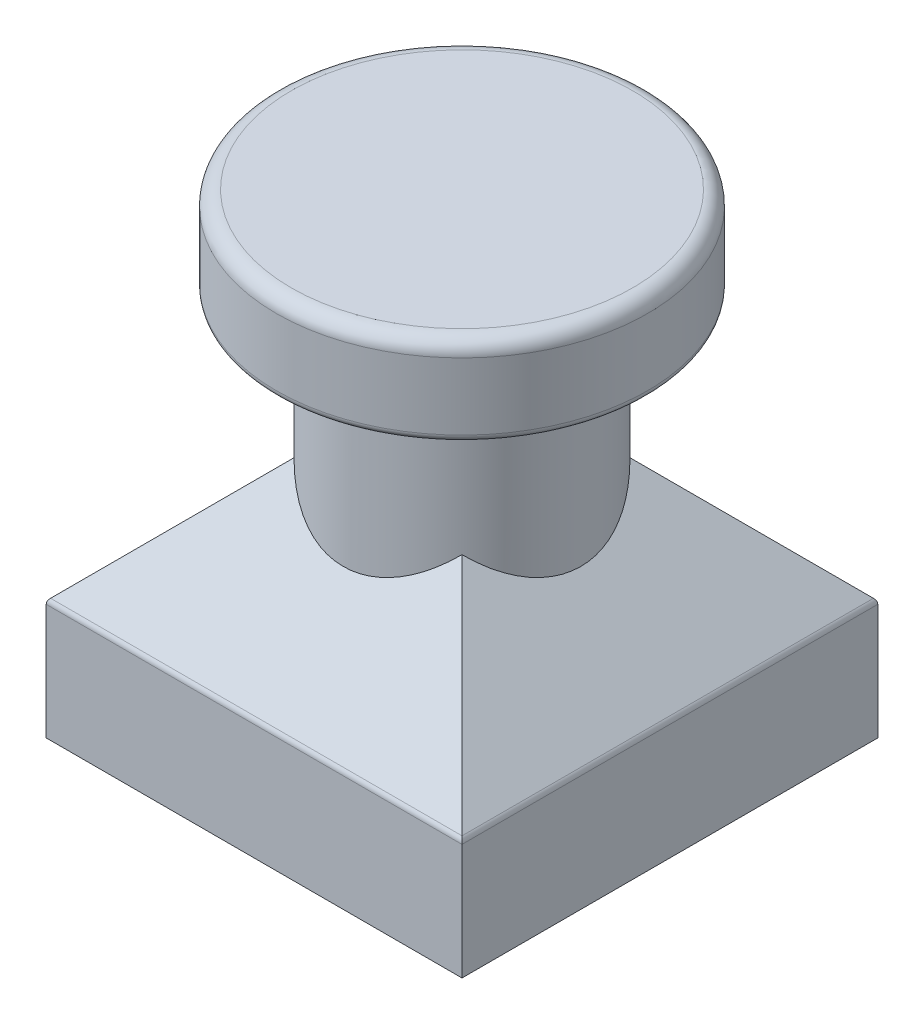
ISO-10303-21;
HEADER;
FILE_DESCRIPTION(('STEP AP214'),'2;1');
FILE_NAME('part.step','',(''),(''),'','','');
FILE_SCHEMA(('AUTOMOTIVE_DESIGN { 1 0 10303 214 1 1 1 1 }'));
ENDSEC;
DATA;
#1=APPLICATION_CONTEXT('core data for automotive mechanical design processes');
#2=APPLICATION_PROTOCOL_DEFINITION('international standard','automotive_design',2000,#1);
#3=PRODUCT_CONTEXT('',#1,'mechanical');
#4=PRODUCT('Part','Part','',(#3));
#5=PRODUCT_RELATED_PRODUCT_CATEGORY('part','',(#4));
#6=PRODUCT_DEFINITION_FORMATION('','',#4);
#7=PRODUCT_DEFINITION_CONTEXT('part definition',#1,'design');
#8=PRODUCT_DEFINITION('design','',#6,#7);
#9=PRODUCT_DEFINITION_SHAPE('','',#8);
#10=(LENGTH_UNIT() NAMED_UNIT(*) SI_UNIT(.MILLI.,.METRE.));
#11=(NAMED_UNIT(*) PLANE_ANGLE_UNIT() SI_UNIT($,.RADIAN.));
#12=(NAMED_UNIT(*) SI_UNIT($,.STERADIAN.) SOLID_ANGLE_UNIT());
#13=UNCERTAINTY_MEASURE_WITH_UNIT(LENGTH_MEASURE(1.E-05),#10,'distance_accuracy_value','');
#14=(GEOMETRIC_REPRESENTATION_CONTEXT(3) GLOBAL_UNCERTAINTY_ASSIGNED_CONTEXT((#13)) GLOBAL_UNIT_ASSIGNED_CONTEXT((#10,
#11,#12)) REPRESENTATION_CONTEXT('',''));
#15=CARTESIAN_POINT('',(0.,0.,0.));
#16=DIRECTION('',(0.,0.,1.));
#17=DIRECTION('',(1.,0.,0.));
#18=AXIS2_PLACEMENT_3D('',#15,#16,#17);
#19=CARTESIAN_POINT('',(7.,16.,-7.));
#20=DIRECTION('',(-1.,0.,0.));
#21=DIRECTION('',(0.,0.,1.));
#22=AXIS2_PLACEMENT_3D('',#19,#20,#21);
#23=PLANE('',#22);
#24=DIRECTION('',(0.,-1.,0.));
#25=VECTOR('',#24,1.);
#26=CARTESIAN_POINT('',(7.,16.,-7.));
#27=LINE('',#26,#25);
#28=CARTESIAN_POINT('',(7.,3.89644660940669,-7.));
#29=VERTEX_POINT('',#28);
#30=CARTESIAN_POINT('',(7.,0.,-7.));
#31=VERTEX_POINT('',#30);
#32=EDGE_CURVE('E100',#29,#31,#27,.T.);
#33=ORIENTED_EDGE('',*,*,#32,.F.);
#34=DIRECTION('',(0.,0.,1.));
#35=VECTOR('',#34,1.);
#36=CARTESIAN_POINT('',(7.,3.89644660940669,7.));
#37=LINE('',#36,#35);
#38=CARTESIAN_POINT('',(7.,3.89644660940669,7.));
#39=VERTEX_POINT('',#38);
#40=EDGE_CURVE('E164',#29,#39,#37,.T.);
#41=ORIENTED_EDGE('',*,*,#40,.T.);
#42=DIRECTION('',(0.,-1.,0.));
#43=VECTOR('',#42,1.);
#44=CARTESIAN_POINT('',(7.,16.,7.));
#45=LINE('',#44,#43);
#46=CARTESIAN_POINT('',(7.,0.,7.));
#47=VERTEX_POINT('',#46);
#48=EDGE_CURVE('E121',#39,#47,#45,.T.);
#49=ORIENTED_EDGE('',*,*,#48,.T.);
#50=DIRECTION('',(0.,0.,-1.));
#51=VECTOR('',#50,1.);
#52=CARTESIAN_POINT('',(7.,0.,-7.));
#53=LINE('',#52,#51);
#54=EDGE_CURVE('E117',#47,#31,#53,.T.);
#55=ORIENTED_EDGE('',*,*,#54,.T.);
#56=EDGE_LOOP('',(#33,#41,#49,#55));
#57=FACE_BOUND('',#56,.T.);
#58=ADVANCED_FACE('F32',(#57),#23,.F.);
#59=CARTESIAN_POINT('',(-7.,16.,-7.));
#60=DIRECTION('',(0.,0.,1.));
#61=DIRECTION('',(1.,0.,0.));
#62=AXIS2_PLACEMENT_3D('',#59,#60,#61);
#63=PLANE('',#62);
#64=DIRECTION('',(0.,-1.,0.));
#65=VECTOR('',#64,1.);
#66=CARTESIAN_POINT('',(-7.,16.,-7.));
#67=LINE('',#66,#65);
#68=CARTESIAN_POINT('',(-7.,3.89644660940669,-7.));
#69=VERTEX_POINT('',#68);
#70=CARTESIAN_POINT('',(-7.,0.,-7.));
#71=VERTEX_POINT('',#70);
#72=EDGE_CURVE('E111',#69,#71,#67,.T.);
#73=ORIENTED_EDGE('',*,*,#72,.F.);
#74=DIRECTION('',(1.,0.,0.));
#75=VECTOR('',#74,1.);
#76=CARTESIAN_POINT('',(7.,3.89644660940669,-7.));
#77=LINE('',#76,#75);
#78=EDGE_CURVE('E107',#69,#29,#77,.T.);
#79=ORIENTED_EDGE('',*,*,#78,.T.);
#80=ORIENTED_EDGE('',*,*,#32,.T.);
#81=DIRECTION('',(-1.,0.,0.));
#82=VECTOR('',#81,1.);
#83=CARTESIAN_POINT('',(-7.,0.,-7.));
#84=LINE('',#83,#82);
#85=EDGE_CURVE('E104',#31,#71,#84,.T.);
#86=ORIENTED_EDGE('',*,*,#85,.T.);
#87=EDGE_LOOP('',(#73,#79,#80,#86));
#88=FACE_BOUND('',#87,.T.);
#89=ADVANCED_FACE('F103',(#88),#63,.F.);
#90=CARTESIAN_POINT('',(-7.,16.,-7.));
#91=DIRECTION('',(1.,0.,0.));
#92=DIRECTION('',(0.,0.,-1.));
#93=AXIS2_PLACEMENT_3D('',#90,#91,#92);
#94=PLANE('',#93);
#95=DIRECTION('',(0.,-1.,0.));
#96=VECTOR('',#95,1.);
#97=CARTESIAN_POINT('',(-7.,16.,7.));
#98=LINE('',#97,#96);
#99=CARTESIAN_POINT('',(-7.,3.89644660940669,7.));
#100=VERTEX_POINT('',#99);
#101=CARTESIAN_POINT('',(-7.,0.,7.));
#102=VERTEX_POINT('',#101);
#103=EDGE_CURVE('E133',#100,#102,#98,.T.);
#104=ORIENTED_EDGE('',*,*,#103,.F.);
#105=DIRECTION('',(0.,0.,-1.));
#106=VECTOR('',#105,1.);
#107=CARTESIAN_POINT('',(-7.,3.89644660940669,-7.));
#108=LINE('',#107,#106);
#109=EDGE_CURVE('E171',#100,#69,#108,.T.);
#110=ORIENTED_EDGE('',*,*,#109,.T.);
#111=ORIENTED_EDGE('',*,*,#72,.T.);
#112=DIRECTION('',(0.,0.,1.));
#113=VECTOR('',#112,1.);
#114=CARTESIAN_POINT('',(-7.,0.,-7.));
#115=LINE('',#114,#113);
#116=EDGE_CURVE('E119',#71,#102,#115,.T.);
#117=ORIENTED_EDGE('',*,*,#116,.T.);
#118=EDGE_LOOP('',(#104,#110,#111,#117));
#119=FACE_BOUND('',#118,.T.);
#120=ADVANCED_FACE('F203',(#119),#94,.F.);
#121=CARTESIAN_POINT('',(-7.,16.,7.));
#122=DIRECTION('',(0.,0.,-1.));
#123=DIRECTION('',(-1.,0.,0.));
#124=AXIS2_PLACEMENT_3D('',#121,#122,#123);
#125=PLANE('',#124);
#126=ORIENTED_EDGE('',*,*,#48,.F.);
#127=DIRECTION('',(-1.,0.,0.));
#128=VECTOR('',#127,1.);
#129=CARTESIAN_POINT('',(-7.,3.89644660940669,7.));
#130=LINE('',#129,#128);
#131=EDGE_CURVE('E55',#39,#100,#130,.T.);
#132=ORIENTED_EDGE('',*,*,#131,.T.);
#133=ORIENTED_EDGE('',*,*,#103,.T.);
#134=DIRECTION('',(1.,0.,0.));
#135=VECTOR('',#134,1.);
#136=CARTESIAN_POINT('',(-7.,0.,7.));
#137=LINE('',#136,#135);
#138=EDGE_CURVE('E130',#102,#47,#137,.T.);
#139=ORIENTED_EDGE('',*,*,#138,.T.);
#140=EDGE_LOOP('',(#126,#132,#133,#139));
#141=FACE_BOUND('',#140,.T.);
#142=ADVANCED_FACE('F253',(#141),#125,.F.);
#143=CARTESIAN_POINT('',(0.,0.,0.));
#144=DIRECTION('',(0.,1.,0.));
#145=DIRECTION('',(0.,0.,1.));
#146=AXIS2_PLACEMENT_3D('',#143,#144,#145);
#147=PLANE('',#146);
#148=ORIENTED_EDGE('',*,*,#54,.F.);
#149=ORIENTED_EDGE('',*,*,#138,.F.);
#150=ORIENTED_EDGE('',*,*,#116,.F.);
#151=ORIENTED_EDGE('',*,*,#85,.F.);
#152=EDGE_LOOP('',(#148,#149,#150,#151));
#153=FACE_BOUND('',#152,.T.);
#154=ADVANCED_FACE('F115',(#153),#147,.F.);
#155=CARTESIAN_POINT('',(0.,0.,0.));
#156=DIRECTION('',(0.,-1.,0.));
#157=DIRECTION('',(0.,0.,-1.));
#158=AXIS2_PLACEMENT_3D('',#155,#156,#157);
#159=CYLINDRICAL_SURFACE('',#158,6.25);
#160=CARTESIAN_POINT('',(0.,13.25,0.));
#161=DIRECTION('',(0.,-1.,0.));
#162=DIRECTION('',(0.,0.,-1.));
#163=AXIS2_PLACEMENT_3D('',#160,#161,#162);
#164=CIRCLE('',#163,6.25);
#165=CARTESIAN_POINT('',(0.,13.25,-6.25));
#166=VERTEX_POINT('',#165);
#167=EDGE_CURVE('E11',#166,#166,#164,.F.);
#168=ORIENTED_EDGE('',*,*,#167,.T.);
#169=EDGE_LOOP('',(#168));
#170=FACE_BOUND('',#169,.T.);
#171=CARTESIAN_POINT('',(0.,15.5,0.));
#172=DIRECTION('',(0.,1.,0.));
#173=DIRECTION('',(0.,0.,1.));
#174=AXIS2_PLACEMENT_3D('',#171,#172,#173);
#175=CIRCLE('',#174,6.25);
#176=CARTESIAN_POINT('',(0.,15.5,6.25));
#177=VERTEX_POINT('',#176);
#178=EDGE_CURVE('E145',#177,#177,#175,.F.);
#179=ORIENTED_EDGE('',*,*,#178,.T.);
#180=EDGE_LOOP('',(#179));
#181=FACE_BOUND('',#180,.T.);
#182=ADVANCED_FACE('F260',(#170,#181),#159,.T.);
#183=CARTESIAN_POINT('',(0.,13.,0.));
#184=DIRECTION('',(0.,-1.,0.));
#185=DIRECTION('',(0.,0.,-1.));
#186=AXIS2_PLACEMENT_3D('',#183,#184,#185);
#187=PLANE('',#186);
#188=CARTESIAN_POINT('',(0.,13.,0.));
#189=DIRECTION('',(0.,-1.,0.));
#190=DIRECTION('',(0.,0.,-1.));
#191=AXIS2_PLACEMENT_3D('',#188,#189,#190);
#192=CIRCLE('',#191,6.);
#193=CARTESIAN_POINT('',(0.,13.,-6.));
#194=VERTEX_POINT('',#193);
#195=EDGE_CURVE('E40',#194,#194,#192,.T.);
#196=ORIENTED_EDGE('',*,*,#195,.T.);
#197=EDGE_LOOP('',(#196));
#198=FACE_BOUND('',#197,.T.);
#199=CARTESIAN_POINT('',(0.,13.,0.));
#200=DIRECTION('',(0.,-1.,0.));
#201=DIRECTION('',(0.,0.,-1.));
#202=AXIS2_PLACEMENT_3D('',#199,#200,#201);
#203=CIRCLE('',#202,4.);
#204=CARTESIAN_POINT('',(0.,13.,-4.));
#205=VERTEX_POINT('',#204);
#206=EDGE_CURVE('E123',#205,#205,#203,.T.);
#207=ORIENTED_EDGE('',*,*,#206,.F.);
#208=EDGE_LOOP('',(#207));
#209=FACE_BOUND('',#208,.T.);
#210=ADVANCED_FACE('F185',(#198,#209),#187,.T.);
#211=CARTESIAN_POINT('',(0.,0.,0.));
#212=DIRECTION('',(0.,-1.,0.));
#213=DIRECTION('',(0.,0.,-1.));
#214=AXIS2_PLACEMENT_3D('',#211,#212,#213);
#215=CYLINDRICAL_SURFACE('',#214,4.);
#216=CARTESIAN_POINT('',(0.,10.9999999999999,0.));
#217=DIRECTION('',(-0.707106781186544,0.707106781186551,0.));
#218=DIRECTION('',(-0.707106781186551,-0.707106781186544,0.));
#219=AXIS2_PLACEMENT_3D('',#216,#217,#218);
#220=ELLIPSE('',#219,5.65685424949235,4.);
#221=CARTESIAN_POINT('',(-2.82842712474619,8.17157287525373,-2.82842712474619));
#222=VERTEX_POINT('',#221);
#223=CARTESIAN_POINT('',(-2.82842712474619,8.17157287525373,2.82842712474619));
#224=VERTEX_POINT('',#223);
#225=EDGE_CURVE('E110',#222,#224,#220,.T.);
#226=ORIENTED_EDGE('',*,*,#225,.T.);
#227=CARTESIAN_POINT('',(0.,10.9999999999999,0.));
#228=DIRECTION('',(0.,0.707106781186551,0.707106781186544));
#229=DIRECTION('',(0.,-0.707106781186544,0.707106781186551));
#230=AXIS2_PLACEMENT_3D('',#227,#228,#229);
#231=ELLIPSE('',#230,5.65685424949235,4.);
#232=CARTESIAN_POINT('',(2.82842712474619,8.17157287525373,2.82842712474619));
#233=VERTEX_POINT('',#232);
#234=EDGE_CURVE('E142',#224,#233,#231,.T.);
#235=ORIENTED_EDGE('',*,*,#234,.T.);
#236=CARTESIAN_POINT('',(0.,10.9999999999999,0.));
#237=DIRECTION('',(0.707106781186544,0.707106781186551,0.));
#238=DIRECTION('',(0.707106781186551,-0.707106781186544,0.));
#239=AXIS2_PLACEMENT_3D('',#236,#237,#238);
#240=ELLIPSE('',#239,5.65685424949235,4.);
#241=CARTESIAN_POINT('',(2.82842712474619,8.17157287525373,-2.82842712474619));
#242=VERTEX_POINT('',#241);
#243=EDGE_CURVE('E140',#233,#242,#240,.T.);
#244=ORIENTED_EDGE('',*,*,#243,.T.);
#245=CARTESIAN_POINT('',(0.,10.9999999999999,0.));
#246=DIRECTION('',(0.,0.707106781186551,-0.707106781186544));
#247=DIRECTION('',(0.,-0.707106781186544,-0.707106781186551));
#248=AXIS2_PLACEMENT_3D('',#245,#246,#247);
#249=ELLIPSE('',#248,5.65685424949235,4.);
#250=EDGE_CURVE('E138',#242,#222,#249,.T.);
#251=ORIENTED_EDGE('',*,*,#250,.T.);
#252=EDGE_LOOP('',(#226,#235,#244,#251));
#253=FACE_BOUND('',#252,.T.);
#254=ORIENTED_EDGE('',*,*,#206,.T.);
#255=EDGE_LOOP('',(#254));
#256=FACE_BOUND('',#255,.T.);
#257=ADVANCED_FACE('F265',(#253,#256),#215,.T.);
#258=CARTESIAN_POINT('',(0.,16.,0.));
#259=DIRECTION('',(0.,1.,0.));
#260=DIRECTION('',(0.,0.,1.));
#261=AXIS2_PLACEMENT_3D('',#258,#259,#260);
#262=PLANE('',#261);
#263=CARTESIAN_POINT('',(0.,16.,0.));
#264=DIRECTION('',(0.,1.,0.));
#265=DIRECTION('',(0.,0.,1.));
#266=AXIS2_PLACEMENT_3D('',#263,#264,#265);
#267=CIRCLE('',#266,5.75);
#268=CARTESIAN_POINT('',(0.,16.,5.75));
#269=VERTEX_POINT('',#268);
#270=EDGE_CURVE('E157',#269,#269,#267,.T.);
#271=ORIENTED_EDGE('',*,*,#270,.T.);
#272=EDGE_LOOP('',(#271));
#273=FACE_BOUND('',#272,.T.);
#274=ADVANCED_FACE('F222',(#273),#262,.T.);
#275=CARTESIAN_POINT('',(1.99999999999991,9.,0.));
#276=DIRECTION('',(0.707106781186544,0.707106781186551,0.));
#277=DIRECTION('',(0.,0.,1.));
#278=AXIS2_PLACEMENT_3D('',#275,#276,#277);
#279=PLANE('',#278);
#280=DIRECTION('',(-0.577350269189628,0.577350269189622,-0.577350269189628));
#281=VECTOR('',#280,1.);
#282=CARTESIAN_POINT('',(1.33333333333327,9.66666666666664,1.33333333333327));
#283=LINE('',#282,#281);
#284=CARTESIAN_POINT('',(6.92677669529664,4.07322330470333,6.92677669529664));
#285=VERTEX_POINT('',#284);
#286=EDGE_CURVE('E151',#285,#233,#283,.T.);
#287=ORIENTED_EDGE('',*,*,#286,.F.);
#288=DIRECTION('',(0.,0.,1.));
#289=VECTOR('',#288,1.);
#290=CARTESIAN_POINT('',(6.92677669529664,4.07322330470333,-7.));
#291=LINE('',#290,#289);
#292=CARTESIAN_POINT('',(6.92677669529663,4.07322330470333,-6.92677669529663));
#293=VERTEX_POINT('',#292);
#294=EDGE_CURVE('E166',#285,#293,#291,.F.);
#295=ORIENTED_EDGE('',*,*,#294,.T.);
#296=DIRECTION('',(-0.577350269189628,0.577350269189622,0.577350269189628));
#297=VECTOR('',#296,1.);
#298=CARTESIAN_POINT('',(1.33333333333327,9.66666666666664,-1.33333333333327));
#299=LINE('',#298,#297);
#300=EDGE_CURVE('E126',#242,#293,#299,.F.);
#301=ORIENTED_EDGE('',*,*,#300,.F.);
#302=ORIENTED_EDGE('',*,*,#243,.F.);
#303=EDGE_LOOP('',(#287,#295,#301,#302));
#304=FACE_BOUND('',#303,.T.);
#305=ADVANCED_FACE('F218',(#304),#279,.T.);
#306=CARTESIAN_POINT('',(0.,9.,-1.99999999999991));
#307=DIRECTION('',(0.,0.707106781186551,-0.707106781186544));
#308=DIRECTION('',(1.,0.,0.));
#309=AXIS2_PLACEMENT_3D('',#306,#307,#308);
#310=PLANE('',#309);
#311=ORIENTED_EDGE('',*,*,#300,.T.);
#312=DIRECTION('',(1.,0.,0.));
#313=VECTOR('',#312,1.);
#314=CARTESIAN_POINT('',(-7.,4.07322330470333,-6.92677669529663));
#315=LINE('',#314,#313);
#316=CARTESIAN_POINT('',(-6.92677669529664,4.07322330470333,-6.92677669529664));
#317=VERTEX_POINT('',#316);
#318=EDGE_CURVE('E161',#293,#317,#315,.F.);
#319=ORIENTED_EDGE('',*,*,#318,.T.);
#320=DIRECTION('',(0.577350269189628,0.577350269189622,0.577350269189628));
#321=VECTOR('',#320,1.);
#322=CARTESIAN_POINT('',(-1.33333333333327,9.66666666666664,-1.33333333333327));
#323=LINE('',#322,#321);
#324=EDGE_CURVE('E148',#222,#317,#323,.F.);
#325=ORIENTED_EDGE('',*,*,#324,.F.);
#326=ORIENTED_EDGE('',*,*,#250,.F.);
#327=EDGE_LOOP('',(#311,#319,#325,#326));
#328=FACE_BOUND('',#327,.T.);
#329=ADVANCED_FACE('F214',(#328),#310,.T.);
#330=CARTESIAN_POINT('',(0.,9.,1.99999999999991));
#331=DIRECTION('',(0.,0.707106781186551,0.707106781186544));
#332=DIRECTION('',(-1.,0.,0.));
#333=AXIS2_PLACEMENT_3D('',#330,#331,#332);
#334=PLANE('',#333);
#335=DIRECTION('',(-0.577350269189628,-0.577350269189622,0.577350269189628));
#336=VECTOR('',#335,1.);
#337=CARTESIAN_POINT('',(-1.33333333333327,9.66666666666664,1.33333333333327));
#338=LINE('',#337,#336);
#339=CARTESIAN_POINT('',(-6.92677669529663,4.07322330470333,6.92677669529664));
#340=VERTEX_POINT('',#339);
#341=EDGE_CURVE('E146',#340,#224,#338,.F.);
#342=ORIENTED_EDGE('',*,*,#341,.F.);
#343=DIRECTION('',(-1.,0.,0.));
#344=VECTOR('',#343,1.);
#345=CARTESIAN_POINT('',(7.,4.07322330470333,6.92677669529664));
#346=LINE('',#345,#344);
#347=EDGE_CURVE('E169',#340,#285,#346,.F.);
#348=ORIENTED_EDGE('',*,*,#347,.T.);
#349=ORIENTED_EDGE('',*,*,#286,.T.);
#350=ORIENTED_EDGE('',*,*,#234,.F.);
#351=EDGE_LOOP('',(#342,#348,#349,#350));
#352=FACE_BOUND('',#351,.T.);
#353=ADVANCED_FACE('F211',(#352),#334,.T.);
#354=CARTESIAN_POINT('',(-1.99999999999991,9.,0.));
#355=DIRECTION('',(-0.707106781186544,0.707106781186551,0.));
#356=DIRECTION('',(0.,0.,-1.));
#357=AXIS2_PLACEMENT_3D('',#354,#355,#356);
#358=PLANE('',#357);
#359=ORIENTED_EDGE('',*,*,#324,.T.);
#360=DIRECTION('',(0.,0.,-1.));
#361=VECTOR('',#360,1.);
#362=CARTESIAN_POINT('',(-6.92677669529664,4.07322330470333,7.));
#363=LINE('',#362,#361);
#364=EDGE_CURVE('E47',#317,#340,#363,.F.);
#365=ORIENTED_EDGE('',*,*,#364,.T.);
#366=ORIENTED_EDGE('',*,*,#341,.T.);
#367=ORIENTED_EDGE('',*,*,#225,.F.);
#368=EDGE_LOOP('',(#359,#365,#366,#367));
#369=FACE_BOUND('',#368,.T.);
#370=ADVANCED_FACE('F207',(#369),#358,.T.);
#371=CARTESIAN_POINT('',(0.,15.5,0.));
#372=DIRECTION('',(0.,1.,0.));
#373=DIRECTION('',(0.,0.,1.));
#374=AXIS2_PLACEMENT_3D('',#371,#372,#373);
#375=TOROIDAL_SURFACE('',#374,5.75,0.5);
#376=ORIENTED_EDGE('',*,*,#270,.F.);
#377=EDGE_LOOP('',(#376));
#378=FACE_BOUND('',#377,.T.);
#379=ORIENTED_EDGE('',*,*,#178,.F.);
#380=EDGE_LOOP('',(#379));
#381=FACE_BOUND('',#380,.T.);
#382=ADVANCED_FACE('F210',(#378,#381),#375,.T.);
#383=CARTESIAN_POINT('',(-7.,3.89644660940669,6.75));
#384=DIRECTION('',(1.,0.,0.));
#385=DIRECTION('',(0.,0.,-1.));
#386=AXIS2_PLACEMENT_3D('',#383,#384,#385);
#387=CYLINDRICAL_SURFACE('',#386,0.25);
#388=CARTESIAN_POINT('',(6.75,3.89644660940669,6.75));
#389=DIRECTION('',(0.707106781186547,0.,-0.707106781186548));
#390=DIRECTION('',(0.707106781186548,0.,0.707106781186547));
#391=AXIS2_PLACEMENT_3D('',#388,#389,#390);
#392=ELLIPSE('',#391,0.353553390593274,0.25);
#393=EDGE_CURVE('E178',#285,#39,#392,.T.);
#394=ORIENTED_EDGE('',*,*,#393,.F.);
#395=ORIENTED_EDGE('',*,*,#347,.F.);
#396=CARTESIAN_POINT('',(-6.75,3.89644660940669,6.75));
#397=DIRECTION('',(0.707106781186548,0.,0.707106781186547));
#398=DIRECTION('',(-0.707106781186547,0.,0.707106781186548));
#399=AXIS2_PLACEMENT_3D('',#396,#397,#398);
#400=ELLIPSE('',#399,0.353553390593274,0.25);
#401=EDGE_CURVE('E149',#100,#340,#400,.F.);
#402=ORIENTED_EDGE('',*,*,#401,.F.);
#403=ORIENTED_EDGE('',*,*,#131,.F.);
#404=EDGE_LOOP('',(#394,#395,#402,#403));
#405=FACE_BOUND('',#404,.T.);
#406=ADVANCED_FACE('F225',(#405),#387,.T.);
#407=CARTESIAN_POINT('',(-6.75,3.89644660940669,-7.));
#408=DIRECTION('',(0.,0.,1.));
#409=DIRECTION('',(1.,0.,0.));
#410=AXIS2_PLACEMENT_3D('',#407,#408,#409);
#411=CYLINDRICAL_SURFACE('',#410,0.25);
#412=ORIENTED_EDGE('',*,*,#401,.T.);
#413=ORIENTED_EDGE('',*,*,#364,.F.);
#414=CARTESIAN_POINT('',(-6.75,3.89644660940669,-6.75));
#415=DIRECTION('',(-0.707106781186547,0.,0.707106781186548));
#416=DIRECTION('',(0.707106781186548,0.,0.707106781186547));
#417=AXIS2_PLACEMENT_3D('',#414,#415,#416);
#418=ELLIPSE('',#417,0.353553390593274,0.25);
#419=EDGE_CURVE('E176',#69,#317,#418,.F.);
#420=ORIENTED_EDGE('',*,*,#419,.F.);
#421=ORIENTED_EDGE('',*,*,#109,.F.);
#422=EDGE_LOOP('',(#412,#413,#420,#421));
#423=FACE_BOUND('',#422,.T.);
#424=ADVANCED_FACE('F230',(#423),#411,.T.);
#425=CARTESIAN_POINT('',(6.75,3.89644660940669,-7.));
#426=DIRECTION('',(0.,0.,-1.));
#427=DIRECTION('',(-1.,0.,0.));
#428=AXIS2_PLACEMENT_3D('',#425,#426,#427);
#429=CYLINDRICAL_SURFACE('',#428,0.25);
#430=ORIENTED_EDGE('',*,*,#393,.T.);
#431=ORIENTED_EDGE('',*,*,#40,.F.);
#432=CARTESIAN_POINT('',(6.75,3.89644660940669,-6.75));
#433=DIRECTION('',(-0.707106781186548,0.,-0.707106781186547));
#434=DIRECTION('',(0.707106781186547,0.,-0.707106781186548));
#435=AXIS2_PLACEMENT_3D('',#432,#433,#434);
#436=ELLIPSE('',#435,0.353553390593274,0.25);
#437=EDGE_CURVE('E174',#293,#29,#436,.T.);
#438=ORIENTED_EDGE('',*,*,#437,.F.);
#439=ORIENTED_EDGE('',*,*,#294,.F.);
#440=EDGE_LOOP('',(#430,#431,#438,#439));
#441=FACE_BOUND('',#440,.T.);
#442=ADVANCED_FACE('F194',(#441),#429,.T.);
#443=CARTESIAN_POINT('',(-7.,3.89644660940669,-6.75));
#444=DIRECTION('',(-1.,0.,0.));
#445=DIRECTION('',(0.,0.,1.));
#446=AXIS2_PLACEMENT_3D('',#443,#444,#445);
#447=CYLINDRICAL_SURFACE('',#446,0.25);
#448=ORIENTED_EDGE('',*,*,#419,.T.);
#449=ORIENTED_EDGE('',*,*,#318,.F.);
#450=ORIENTED_EDGE('',*,*,#437,.T.);
#451=ORIENTED_EDGE('',*,*,#78,.F.);
#452=EDGE_LOOP('',(#448,#449,#450,#451));
#453=FACE_BOUND('',#452,.T.);
#454=ADVANCED_FACE('F189',(#453),#447,.T.);
#455=CARTESIAN_POINT('',(0.,13.25,0.));
#456=DIRECTION('',(0.,-1.,0.));
#457=DIRECTION('',(0.,0.,-1.));
#458=AXIS2_PLACEMENT_3D('',#455,#456,#457);
#459=TOROIDAL_SURFACE('',#458,6.,0.25);
#460=ORIENTED_EDGE('',*,*,#167,.F.);
#461=EDGE_LOOP('',(#460));
#462=FACE_BOUND('',#461,.T.);
#463=ORIENTED_EDGE('',*,*,#195,.F.);
#464=EDGE_LOOP('',(#463));
#465=FACE_BOUND('',#464,.T.);
#466=ADVANCED_FACE('F34',(#462,#465),#459,.T.);
#467=CLOSED_SHELL('',(#58,#89,#120,#142,#154,#182,#210,#257,#274,#305,#329,#353,#370,#382,#406,
#424,#442,#454,#466));
#468=MANIFOLD_SOLID_BREP('B2',#467);
#469=ADVANCED_BREP_SHAPE_REPRESENTATION('',(#18,#468),#14);
#470=SHAPE_DEFINITION_REPRESENTATION(#9,#469);
ENDSEC;
END-ISO-10303-21;
